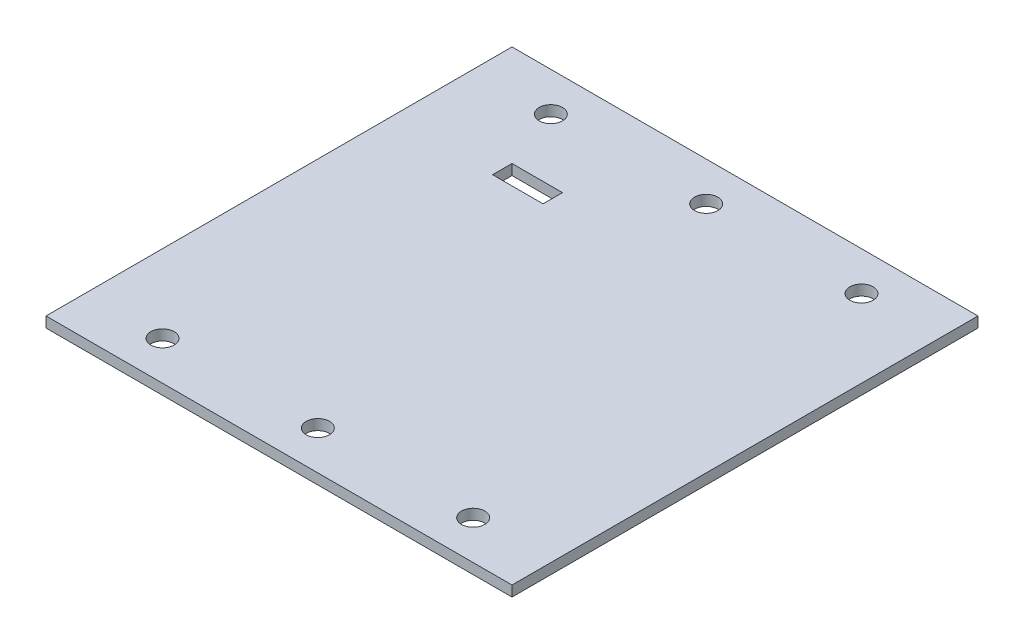
ISO-10303-21;
HEADER;
FILE_DESCRIPTION(('STEP AP214'),'2;1');
FILE_NAME('part.step','',(''),(''),'','','');
FILE_SCHEMA(('AUTOMOTIVE_DESIGN { 1 0 10303 214 1 1 1 1 }'));
ENDSEC;
DATA;
#1=APPLICATION_CONTEXT('core data for automotive mechanical design processes');
#2=APPLICATION_PROTOCOL_DEFINITION('international standard','automotive_design',2000,#1);
#3=PRODUCT_CONTEXT('',#1,'mechanical');
#4=PRODUCT('Part','Part','',(#3));
#5=PRODUCT_RELATED_PRODUCT_CATEGORY('part','',(#4));
#6=PRODUCT_DEFINITION_FORMATION('','',#4);
#7=PRODUCT_DEFINITION_CONTEXT('part definition',#1,'design');
#8=PRODUCT_DEFINITION('design','',#6,#7);
#9=PRODUCT_DEFINITION_SHAPE('','',#8);
#10=(LENGTH_UNIT() NAMED_UNIT(*) SI_UNIT(.MILLI.,.METRE.));
#11=(NAMED_UNIT(*) PLANE_ANGLE_UNIT() SI_UNIT($,.RADIAN.));
#12=(NAMED_UNIT(*) SI_UNIT($,.STERADIAN.) SOLID_ANGLE_UNIT());
#13=UNCERTAINTY_MEASURE_WITH_UNIT(LENGTH_MEASURE(1.E-05),#10,'distance_accuracy_value','');
#14=(GEOMETRIC_REPRESENTATION_CONTEXT(3) GLOBAL_UNCERTAINTY_ASSIGNED_CONTEXT((#13)) GLOBAL_UNIT_ASSIGNED_CONTEXT((#10,
#11,#12)) REPRESENTATION_CONTEXT('',''));
#15=CARTESIAN_POINT('',(0.,0.,0.));
#16=DIRECTION('',(0.,0.,1.));
#17=DIRECTION('',(1.,0.,0.));
#18=AXIS2_PLACEMENT_3D('',#15,#16,#17);
#19=CARTESIAN_POINT('',(60.,2.7,60.));
#20=DIRECTION('',(-1.,0.,0.));
#21=DIRECTION('',(0.,0.,1.));
#22=AXIS2_PLACEMENT_3D('',#19,#20,#21);
#23=PLANE('',#22);
#24=DIRECTION('',(0.,0.,-1.));
#25=VECTOR('',#24,1.);
#26=CARTESIAN_POINT('',(60.,0.,60.));
#27=LINE('',#26,#25);
#28=CARTESIAN_POINT('',(60.,0.,60.));
#29=VERTEX_POINT('',#28);
#30=CARTESIAN_POINT('',(60.,0.,-60.));
#31=VERTEX_POINT('',#30);
#32=EDGE_CURVE('E179',#29,#31,#27,.T.);
#33=ORIENTED_EDGE('',*,*,#32,.T.);
#34=DIRECTION('',(0.,-1.,0.));
#35=VECTOR('',#34,1.);
#36=CARTESIAN_POINT('',(60.,2.7,-60.));
#37=LINE('',#36,#35);
#38=CARTESIAN_POINT('',(60.,2.7,-60.));
#39=VERTEX_POINT('',#38);
#40=EDGE_CURVE('E13',#39,#31,#37,.T.);
#41=ORIENTED_EDGE('',*,*,#40,.F.);
#42=DIRECTION('',(0.,0.,-1.));
#43=VECTOR('',#42,1.);
#44=CARTESIAN_POINT('',(60.,2.7,60.));
#45=LINE('',#44,#43);
#46=CARTESIAN_POINT('',(60.,2.7,60.));
#47=VERTEX_POINT('',#46);
#48=EDGE_CURVE('E182',#47,#39,#45,.T.);
#49=ORIENTED_EDGE('',*,*,#48,.F.);
#50=DIRECTION('',(0.,-1.,0.));
#51=VECTOR('',#50,1.);
#52=CARTESIAN_POINT('',(60.,2.7,60.));
#53=LINE('',#52,#51);
#54=EDGE_CURVE('E192',#47,#29,#53,.T.);
#55=ORIENTED_EDGE('',*,*,#54,.T.);
#56=EDGE_LOOP('',(#33,#41,#49,#55));
#57=FACE_BOUND('',#56,.T.);
#58=ADVANCED_FACE('F45',(#57),#23,.F.);
#59=CARTESIAN_POINT('',(-60.,2.7,-60.));
#60=DIRECTION('',(0.,0.,1.));
#61=DIRECTION('',(1.,0.,0.));
#62=AXIS2_PLACEMENT_3D('',#59,#60,#61);
#63=PLANE('',#62);
#64=DIRECTION('',(-1.,0.,0.));
#65=VECTOR('',#64,1.);
#66=CARTESIAN_POINT('',(-60.,0.,-60.));
#67=LINE('',#66,#65);
#68=CARTESIAN_POINT('',(-60.,0.,-60.));
#69=VERTEX_POINT('',#68);
#70=EDGE_CURVE('E195',#31,#69,#67,.T.);
#71=ORIENTED_EDGE('',*,*,#70,.T.);
#72=DIRECTION('',(0.,-1.,0.));
#73=VECTOR('',#72,1.);
#74=CARTESIAN_POINT('',(-60.,2.7,-60.));
#75=LINE('',#74,#73);
#76=CARTESIAN_POINT('',(-60.,2.7,-60.));
#77=VERTEX_POINT('',#76);
#78=EDGE_CURVE('E52',#77,#69,#75,.T.);
#79=ORIENTED_EDGE('',*,*,#78,.F.);
#80=DIRECTION('',(-1.,0.,0.));
#81=VECTOR('',#80,1.);
#82=CARTESIAN_POINT('',(-60.,2.7,-60.));
#83=LINE('',#82,#81);
#84=EDGE_CURVE('E185',#39,#77,#83,.T.);
#85=ORIENTED_EDGE('',*,*,#84,.F.);
#86=ORIENTED_EDGE('',*,*,#40,.T.);
#87=EDGE_LOOP('',(#71,#79,#85,#86));
#88=FACE_BOUND('',#87,.T.);
#89=ADVANCED_FACE('F224',(#88),#63,.F.);
#90=CARTESIAN_POINT('',(-60.,2.7,60.));
#91=DIRECTION('',(1.,0.,0.));
#92=DIRECTION('',(0.,0.,-1.));
#93=AXIS2_PLACEMENT_3D('',#90,#91,#92);
#94=PLANE('',#93);
#95=DIRECTION('',(0.,0.,1.));
#96=VECTOR('',#95,1.);
#97=CARTESIAN_POINT('',(-60.,0.,60.));
#98=LINE('',#97,#96);
#99=CARTESIAN_POINT('',(-60.,0.,60.));
#100=VERTEX_POINT('',#99);
#101=EDGE_CURVE('E197',#69,#100,#98,.T.);
#102=ORIENTED_EDGE('',*,*,#101,.T.);
#103=DIRECTION('',(0.,-1.,0.));
#104=VECTOR('',#103,1.);
#105=CARTESIAN_POINT('',(-60.,2.7,60.));
#106=LINE('',#105,#104);
#107=CARTESIAN_POINT('',(-60.,2.7,60.));
#108=VERTEX_POINT('',#107);
#109=EDGE_CURVE('E202',#108,#100,#106,.T.);
#110=ORIENTED_EDGE('',*,*,#109,.F.);
#111=DIRECTION('',(0.,0.,1.));
#112=VECTOR('',#111,1.);
#113=CARTESIAN_POINT('',(-60.,2.7,60.));
#114=LINE('',#113,#112);
#115=EDGE_CURVE('E188',#77,#108,#114,.T.);
#116=ORIENTED_EDGE('',*,*,#115,.F.);
#117=ORIENTED_EDGE('',*,*,#78,.T.);
#118=EDGE_LOOP('',(#102,#110,#116,#117));
#119=FACE_BOUND('',#118,.T.);
#120=ADVANCED_FACE('F209',(#119),#94,.F.);
#121=CARTESIAN_POINT('',(-60.,2.7,60.));
#122=DIRECTION('',(0.,0.,-1.));
#123=DIRECTION('',(-1.,0.,0.));
#124=AXIS2_PLACEMENT_3D('',#121,#122,#123);
#125=PLANE('',#124);
#126=DIRECTION('',(1.,0.,0.));
#127=VECTOR('',#126,1.);
#128=CARTESIAN_POINT('',(-60.,0.,60.));
#129=LINE('',#128,#127);
#130=EDGE_CURVE('E186',#100,#29,#129,.T.);
#131=ORIENTED_EDGE('',*,*,#130,.T.);
#132=ORIENTED_EDGE('',*,*,#54,.F.);
#133=DIRECTION('',(1.,0.,0.));
#134=VECTOR('',#133,1.);
#135=CARTESIAN_POINT('',(-60.,2.7,60.));
#136=LINE('',#135,#134);
#137=EDGE_CURVE('E190',#108,#47,#136,.T.);
#138=ORIENTED_EDGE('',*,*,#137,.F.);
#139=ORIENTED_EDGE('',*,*,#109,.T.);
#140=EDGE_LOOP('',(#131,#132,#138,#139));
#141=FACE_BOUND('',#140,.T.);
#142=ADVANCED_FACE('F218',(#141),#125,.F.);
#143=CARTESIAN_POINT('',(0.,2.7,0.));
#144=DIRECTION('',(0.,-1.,0.));
#145=DIRECTION('',(0.,0.,-1.));
#146=AXIS2_PLACEMENT_3D('',#143,#144,#145);
#147=PLANE('',#146);
#148=DIRECTION('',(-1.,0.,0.));
#149=VECTOR('',#148,1.);
#150=CARTESIAN_POINT('',(-34.,2.7,-29.));
#151=LINE('',#150,#149);
#152=CARTESIAN_POINT('',(-21.,2.7,-29.));
#153=VERTEX_POINT('',#152);
#154=CARTESIAN_POINT('',(-34.,2.7,-29.));
#155=VERTEX_POINT('',#154);
#156=EDGE_CURVE('E117',#153,#155,#151,.T.);
#157=ORIENTED_EDGE('',*,*,#156,.T.);
#158=DIRECTION('',(0.,0.,-1.));
#159=VECTOR('',#158,1.);
#160=CARTESIAN_POINT('',(-34.,2.7,-34.));
#161=LINE('',#160,#159);
#162=CARTESIAN_POINT('',(-34.,2.7,-34.));
#163=VERTEX_POINT('',#162);
#164=EDGE_CURVE('E111',#155,#163,#161,.T.);
#165=ORIENTED_EDGE('',*,*,#164,.T.);
#166=DIRECTION('',(1.,0.,0.));
#167=VECTOR('',#166,1.);
#168=CARTESIAN_POINT('',(-34.,2.7,-34.));
#169=LINE('',#168,#167);
#170=CARTESIAN_POINT('',(-21.,2.7,-34.));
#171=VERTEX_POINT('',#170);
#172=EDGE_CURVE('E120',#163,#171,#169,.T.);
#173=ORIENTED_EDGE('',*,*,#172,.T.);
#174=DIRECTION('',(0.,0.,1.));
#175=VECTOR('',#174,1.);
#176=CARTESIAN_POINT('',(-21.,2.7,-34.));
#177=LINE('',#176,#175);
#178=EDGE_CURVE('E59',#171,#153,#177,.T.);
#179=ORIENTED_EDGE('',*,*,#178,.T.);
#180=EDGE_LOOP('',(#157,#165,#173,#179));
#181=FACE_BOUND('',#180,.T.);
#182=CARTESIAN_POINT('',(40.,2.7,-50.));
#183=DIRECTION('',(0.,1.,0.));
#184=DIRECTION('',(0.,0.,1.));
#185=AXIS2_PLACEMENT_3D('',#182,#183,#184);
#186=CIRCLE('',#185,3.);
#187=CARTESIAN_POINT('',(40.,2.7,-47.));
#188=VERTEX_POINT('',#187);
#189=EDGE_CURVE('E156',#188,#188,#186,.T.);
#190=ORIENTED_EDGE('',*,*,#189,.F.);
#191=EDGE_LOOP('',(#190));
#192=FACE_BOUND('',#191,.T.);
#193=CARTESIAN_POINT('',(-40.,2.7,-49.9999999999997));
#194=DIRECTION('',(0.,1.,0.));
#195=DIRECTION('',(0.,0.,1.));
#196=AXIS2_PLACEMENT_3D('',#193,#194,#195);
#197=CIRCLE('',#196,3.);
#198=CARTESIAN_POINT('',(-40.,2.7,-46.9999999999997));
#199=VERTEX_POINT('',#198);
#200=EDGE_CURVE('E162',#199,#199,#197,.T.);
#201=ORIENTED_EDGE('',*,*,#200,.F.);
#202=EDGE_LOOP('',(#201));
#203=FACE_BOUND('',#202,.T.);
#204=CARTESIAN_POINT('',(-40.,2.7,49.9999999999997));
#205=DIRECTION('',(0.,1.,0.));
#206=DIRECTION('',(0.,0.,-1.));
#207=AXIS2_PLACEMENT_3D('',#204,#205,#206);
#208=CIRCLE('',#207,3.);
#209=CARTESIAN_POINT('',(-40.,2.7,52.9999999999997));
#210=VERTEX_POINT('',#209);
#211=EDGE_CURVE('E168',#210,#210,#208,.T.);
#212=ORIENTED_EDGE('',*,*,#211,.F.);
#213=EDGE_LOOP('',(#212));
#214=FACE_BOUND('',#213,.T.);
#215=CARTESIAN_POINT('',(40.,2.7,50.));
#216=DIRECTION('',(0.,1.,0.));
#217=DIRECTION('',(0.,0.,-1.));
#218=AXIS2_PLACEMENT_3D('',#215,#216,#217);
#219=CIRCLE('',#218,3.);
#220=CARTESIAN_POINT('',(40.,2.7,53.));
#221=VERTEX_POINT('',#220);
#222=EDGE_CURVE('E149',#221,#221,#219,.T.);
#223=ORIENTED_EDGE('',*,*,#222,.F.);
#224=EDGE_LOOP('',(#223));
#225=FACE_BOUND('',#224,.T.);
#226=CARTESIAN_POINT('',(0.,2.7,50.));
#227=DIRECTION('',(0.,1.,0.));
#228=DIRECTION('',(0.,0.,-1.));
#229=AXIS2_PLACEMENT_3D('',#226,#227,#228);
#230=CIRCLE('',#229,3.00000000000001);
#231=CARTESIAN_POINT('',(0.,2.7,53.));
#232=VERTEX_POINT('',#231);
#233=EDGE_CURVE('E142',#232,#232,#230,.T.);
#234=ORIENTED_EDGE('',*,*,#233,.F.);
#235=EDGE_LOOP('',(#234));
#236=FACE_BOUND('',#235,.T.);
#237=CARTESIAN_POINT('',(0.,2.7,-50.));
#238=DIRECTION('',(0.,1.,0.));
#239=DIRECTION('',(0.,0.,1.));
#240=AXIS2_PLACEMENT_3D('',#237,#238,#239);
#241=CIRCLE('',#240,3.);
#242=CARTESIAN_POINT('',(0.,2.7,-47.));
#243=VERTEX_POINT('',#242);
#244=EDGE_CURVE('E155',#243,#243,#241,.T.);
#245=ORIENTED_EDGE('',*,*,#244,.F.);
#246=EDGE_LOOP('',(#245));
#247=FACE_BOUND('',#246,.T.);
#248=ORIENTED_EDGE('',*,*,#48,.T.);
#249=ORIENTED_EDGE('',*,*,#84,.T.);
#250=ORIENTED_EDGE('',*,*,#115,.T.);
#251=ORIENTED_EDGE('',*,*,#137,.T.);
#252=EDGE_LOOP('',(#248,#249,#250,#251));
#253=FACE_BOUND('',#252,.T.);
#254=ADVANCED_FACE('F124',(#181,#192,#203,#214,#225,#236,#247,#253),#147,.F.);
#255=CARTESIAN_POINT('',(0.,0.,0.));
#256=DIRECTION('',(0.,-1.,0.));
#257=DIRECTION('',(0.,0.,-1.));
#258=AXIS2_PLACEMENT_3D('',#255,#256,#257);
#259=PLANE('',#258);
#260=DIRECTION('',(0.,0.,-1.));
#261=VECTOR('',#260,1.);
#262=CARTESIAN_POINT('',(-34.,0.,-34.));
#263=LINE('',#262,#261);
#264=CARTESIAN_POINT('',(-34.,0.,-29.));
#265=VERTEX_POINT('',#264);
#266=CARTESIAN_POINT('',(-34.,0.,-34.));
#267=VERTEX_POINT('',#266);
#268=EDGE_CURVE('E67',#265,#267,#263,.T.);
#269=ORIENTED_EDGE('',*,*,#268,.F.);
#270=DIRECTION('',(-1.,0.,0.));
#271=VECTOR('',#270,1.);
#272=CARTESIAN_POINT('',(-34.,0.,-29.));
#273=LINE('',#272,#271);
#274=CARTESIAN_POINT('',(-21.,0.,-29.));
#275=VERTEX_POINT('',#274);
#276=EDGE_CURVE('E127',#275,#265,#273,.T.);
#277=ORIENTED_EDGE('',*,*,#276,.F.);
#278=DIRECTION('',(0.,0.,1.));
#279=VECTOR('',#278,1.);
#280=CARTESIAN_POINT('',(-21.,0.,-34.));
#281=LINE('',#280,#279);
#282=CARTESIAN_POINT('',(-21.,0.,-34.));
#283=VERTEX_POINT('',#282);
#284=EDGE_CURVE('E130',#283,#275,#281,.T.);
#285=ORIENTED_EDGE('',*,*,#284,.F.);
#286=DIRECTION('',(1.,0.,0.));
#287=VECTOR('',#286,1.);
#288=CARTESIAN_POINT('',(-34.,0.,-34.));
#289=LINE('',#288,#287);
#290=EDGE_CURVE('E136',#267,#283,#289,.T.);
#291=ORIENTED_EDGE('',*,*,#290,.F.);
#292=EDGE_LOOP('',(#269,#277,#285,#291));
#293=FACE_BOUND('',#292,.T.);
#294=CARTESIAN_POINT('',(40.,0.,-50.));
#295=DIRECTION('',(0.,1.,0.));
#296=DIRECTION('',(0.,0.,1.));
#297=AXIS2_PLACEMENT_3D('',#294,#295,#296);
#298=CIRCLE('',#297,3.);
#299=CARTESIAN_POINT('',(40.,0.,-47.));
#300=VERTEX_POINT('',#299);
#301=EDGE_CURVE('E152',#300,#300,#298,.T.);
#302=ORIENTED_EDGE('',*,*,#301,.T.);
#303=EDGE_LOOP('',(#302));
#304=FACE_BOUND('',#303,.T.);
#305=CARTESIAN_POINT('',(-40.,0.,-49.9999999999997));
#306=DIRECTION('',(0.,1.,0.));
#307=DIRECTION('',(0.,0.,1.));
#308=AXIS2_PLACEMENT_3D('',#305,#306,#307);
#309=CIRCLE('',#308,3.);
#310=CARTESIAN_POINT('',(-40.,0.,-46.9999999999997));
#311=VERTEX_POINT('',#310);
#312=EDGE_CURVE('E159',#311,#311,#309,.T.);
#313=ORIENTED_EDGE('',*,*,#312,.T.);
#314=EDGE_LOOP('',(#313));
#315=FACE_BOUND('',#314,.T.);
#316=CARTESIAN_POINT('',(-40.,0.,49.9999999999997));
#317=DIRECTION('',(0.,1.,0.));
#318=DIRECTION('',(0.,0.,-1.));
#319=AXIS2_PLACEMENT_3D('',#316,#317,#318);
#320=CIRCLE('',#319,3.);
#321=CARTESIAN_POINT('',(-40.,0.,52.9999999999997));
#322=VERTEX_POINT('',#321);
#323=EDGE_CURVE('E165',#322,#322,#320,.T.);
#324=ORIENTED_EDGE('',*,*,#323,.T.);
#325=EDGE_LOOP('',(#324));
#326=FACE_BOUND('',#325,.T.);
#327=CARTESIAN_POINT('',(40.,0.,50.));
#328=DIRECTION('',(0.,1.,0.));
#329=DIRECTION('',(0.,0.,-1.));
#330=AXIS2_PLACEMENT_3D('',#327,#328,#329);
#331=CIRCLE('',#330,3.);
#332=CARTESIAN_POINT('',(40.,0.,53.));
#333=VERTEX_POINT('',#332);
#334=EDGE_CURVE('E171',#333,#333,#331,.T.);
#335=ORIENTED_EDGE('',*,*,#334,.T.);
#336=EDGE_LOOP('',(#335));
#337=FACE_BOUND('',#336,.T.);
#338=CARTESIAN_POINT('',(0.,0.,50.));
#339=DIRECTION('',(0.,1.,0.));
#340=DIRECTION('',(0.,0.,-1.));
#341=AXIS2_PLACEMENT_3D('',#338,#339,#340);
#342=CIRCLE('',#341,3.00000000000001);
#343=CARTESIAN_POINT('',(0.,0.,53.));
#344=VERTEX_POINT('',#343);
#345=EDGE_CURVE('E146',#344,#344,#342,.T.);
#346=ORIENTED_EDGE('',*,*,#345,.T.);
#347=EDGE_LOOP('',(#346));
#348=FACE_BOUND('',#347,.T.);
#349=CARTESIAN_POINT('',(0.,0.,-50.));
#350=DIRECTION('',(0.,1.,0.));
#351=DIRECTION('',(0.,0.,1.));
#352=AXIS2_PLACEMENT_3D('',#349,#350,#351);
#353=CIRCLE('',#352,3.);
#354=CARTESIAN_POINT('',(0.,0.,-47.));
#355=VERTEX_POINT('',#354);
#356=EDGE_CURVE('E176',#355,#355,#353,.T.);
#357=ORIENTED_EDGE('',*,*,#356,.T.);
#358=EDGE_LOOP('',(#357));
#359=FACE_BOUND('',#358,.T.);
#360=ORIENTED_EDGE('',*,*,#32,.F.);
#361=ORIENTED_EDGE('',*,*,#130,.F.);
#362=ORIENTED_EDGE('',*,*,#101,.F.);
#363=ORIENTED_EDGE('',*,*,#70,.F.);
#364=EDGE_LOOP('',(#360,#361,#362,#363));
#365=FACE_BOUND('',#364,.T.);
#366=ADVANCED_FACE('F215',(#293,#304,#315,#326,#337,#348,#359,#365),#259,.T.);
#367=CARTESIAN_POINT('',(0.,0.,-50.));
#368=DIRECTION('',(0.,1.,0.));
#369=DIRECTION('',(0.,0.,1.));
#370=AXIS2_PLACEMENT_3D('',#367,#368,#369);
#371=CYLINDRICAL_SURFACE('',#370,3.);
#372=CARTESIAN_POINT('',(0.,0.,-47.));
#373=CARTESIAN_POINT('',(0.,0.028125,-47.));
#374=CARTESIAN_POINT('',(0.,0.05625,-47.));
#375=CARTESIAN_POINT('',(0.,0.1125,-47.));
#376=CARTESIAN_POINT('',(0.,0.140625,-47.));
#377=CARTESIAN_POINT('',(0.,0.196875,-47.));
#378=CARTESIAN_POINT('',(0.,0.225,-47.));
#379=CARTESIAN_POINT('',(0.,0.28125,-47.));
#380=CARTESIAN_POINT('',(0.,0.309375,-47.));
#381=CARTESIAN_POINT('',(0.,0.365625,-47.));
#382=CARTESIAN_POINT('',(0.,0.39375,-47.));
#383=CARTESIAN_POINT('',(0.,0.45,-47.));
#384=CARTESIAN_POINT('',(0.,0.478125,-47.));
#385=CARTESIAN_POINT('',(0.,0.534375,-47.));
#386=CARTESIAN_POINT('',(0.,0.5625,-47.));
#387=CARTESIAN_POINT('',(0.,0.61875,-47.));
#388=CARTESIAN_POINT('',(0.,0.646875,-47.));
#389=CARTESIAN_POINT('',(0.,0.703125,-47.));
#390=CARTESIAN_POINT('',(0.,0.73125,-47.));
#391=CARTESIAN_POINT('',(0.,0.7875,-47.));
#392=CARTESIAN_POINT('',(0.,0.815625,-47.));
#393=CARTESIAN_POINT('',(0.,0.871875,-47.));
#394=CARTESIAN_POINT('',(0.,0.9,-47.));
#395=CARTESIAN_POINT('',(0.,0.95625,-47.));
#396=CARTESIAN_POINT('',(0.,0.984375,-47.));
#397=CARTESIAN_POINT('',(0.,1.040625,-47.));
#398=CARTESIAN_POINT('',(0.,1.06875,-47.));
#399=CARTESIAN_POINT('',(0.,1.125,-47.));
#400=CARTESIAN_POINT('',(0.,1.153125,-47.));
#401=CARTESIAN_POINT('',(0.,1.209375,-47.));
#402=CARTESIAN_POINT('',(0.,1.2375,-47.));
#403=CARTESIAN_POINT('',(0.,1.29375,-47.));
#404=CARTESIAN_POINT('',(0.,1.321875,-47.));
#405=CARTESIAN_POINT('',(0.,1.378125,-47.));
#406=CARTESIAN_POINT('',(0.,1.40625,-47.));
#407=CARTESIAN_POINT('',(0.,1.4625,-47.));
#408=CARTESIAN_POINT('',(0.,1.490625,-47.));
#409=CARTESIAN_POINT('',(0.,1.546875,-47.));
#410=CARTESIAN_POINT('',(0.,1.575,-47.));
#411=CARTESIAN_POINT('',(0.,1.63125,-47.));
#412=CARTESIAN_POINT('',(0.,1.659375,-47.));
#413=CARTESIAN_POINT('',(0.,1.715625,-47.));
#414=CARTESIAN_POINT('',(0.,1.74375,-47.));
#415=CARTESIAN_POINT('',(0.,1.8,-47.));
#416=CARTESIAN_POINT('',(0.,1.828125,-47.));
#417=CARTESIAN_POINT('',(0.,1.884375,-47.));
#418=CARTESIAN_POINT('',(0.,1.9125,-47.));
#419=CARTESIAN_POINT('',(0.,1.96875,-47.));
#420=CARTESIAN_POINT('',(0.,1.996875,-47.));
#421=CARTESIAN_POINT('',(0.,2.053125,-47.));
#422=CARTESIAN_POINT('',(0.,2.08125,-47.));
#423=CARTESIAN_POINT('',(0.,2.1375,-47.));
#424=CARTESIAN_POINT('',(0.,2.165625,-47.));
#425=CARTESIAN_POINT('',(0.,2.221875,-47.));
#426=CARTESIAN_POINT('',(0.,2.25,-47.));
#427=CARTESIAN_POINT('',(0.,2.30625,-47.));
#428=CARTESIAN_POINT('',(0.,2.334375,-47.));
#429=CARTESIAN_POINT('',(0.,2.390625,-47.));
#430=CARTESIAN_POINT('',(0.,2.41875,-47.));
#431=CARTESIAN_POINT('',(0.,2.475,-47.));
#432=CARTESIAN_POINT('',(0.,2.503125,-47.));
#433=CARTESIAN_POINT('',(0.,2.559375,-47.));
#434=CARTESIAN_POINT('',(0.,2.5875,-47.));
#435=CARTESIAN_POINT('',(0.,2.64375,-47.));
#436=CARTESIAN_POINT('',(0.,2.671875,-47.));
#437=CARTESIAN_POINT('',(0.,2.7,-47.));
#438=B_SPLINE_CURVE_WITH_KNOTS('',3,(#372,#373,#374,#375,#376,#377,#378,#379,#380,#381,#382,
#383,#384,#385,#386,#387,#388,#389,#390,#391,#392,#393,#394,#395,#396,#397,#398,#399,#400,#401,
#402,#403,#404,#405,#406,#407,#408,#409,#410,#411,#412,#413,#414,#415,#416,#417,#418,#419,#420,
#421,#422,#423,#424,#425,#426,#427,#428,#429,#430,#431,#432,#433,#434,#435,#436,#437),
.UNSPECIFIED.,.F.,.F.,(4,2,2,2,2,2,2,2,2,2,2,2,2,2,2,2,2,2,2,2,2,2,2,2,2,2,2,2,2,2,2,2,4),(0.,
0.084375,0.16875,0.253125,0.3375,0.421875,0.50625,0.590625,0.675,0.759375,0.84375,0.928125,
1.0125,1.096875,1.18125,1.265625,1.35,1.434375,1.51875,1.603125,1.6875,1.771875,1.85625,
1.940625,2.025,2.109375,2.19375,2.278125,2.3625,2.446875,2.53125,2.615625,2.7),.UNSPECIFIED.);
#439=EDGE_CURVE('BSEAM236',#355,#243,#438,.T.);
#440=ORIENTED_EDGE('',*,*,#356,.F.);
#441=ORIENTED_EDGE('',*,*,#244,.T.);
#442=ORIENTED_EDGE('',*,*,#439,.T.);
#443=ORIENTED_EDGE('',*,*,#439,.F.);
#444=EDGE_LOOP('',(#440,#442,#441,#443));
#445=FACE_BOUND('',#444,.T.);
#446=ADVANCED_FACE('F236',(#445),#371,.F.);
#447=CARTESIAN_POINT('',(0.,0.,50.));
#448=DIRECTION('',(0.,1.,0.));
#449=DIRECTION('',(0.,0.,1.));
#450=AXIS2_PLACEMENT_3D('',#447,#448,#449);
#451=CYLINDRICAL_SURFACE('',#450,3.00000000000001);
#452=CARTESIAN_POINT('',(0.,0.,53.));
#453=CARTESIAN_POINT('',(0.,0.028125,53.));
#454=CARTESIAN_POINT('',(0.,0.05625,53.));
#455=CARTESIAN_POINT('',(0.,0.1125,53.));
#456=CARTESIAN_POINT('',(0.,0.140625,53.));
#457=CARTESIAN_POINT('',(0.,0.196875,53.));
#458=CARTESIAN_POINT('',(0.,0.225,53.));
#459=CARTESIAN_POINT('',(0.,0.28125,53.));
#460=CARTESIAN_POINT('',(0.,0.309375,53.));
#461=CARTESIAN_POINT('',(0.,0.365625,53.));
#462=CARTESIAN_POINT('',(0.,0.39375,53.));
#463=CARTESIAN_POINT('',(0.,0.45,53.));
#464=CARTESIAN_POINT('',(0.,0.478125,53.));
#465=CARTESIAN_POINT('',(0.,0.534375,53.));
#466=CARTESIAN_POINT('',(0.,0.5625,53.));
#467=CARTESIAN_POINT('',(0.,0.61875,53.));
#468=CARTESIAN_POINT('',(0.,0.646875,53.));
#469=CARTESIAN_POINT('',(0.,0.703125,53.));
#470=CARTESIAN_POINT('',(0.,0.73125,53.));
#471=CARTESIAN_POINT('',(0.,0.7875,53.));
#472=CARTESIAN_POINT('',(0.,0.815625,53.));
#473=CARTESIAN_POINT('',(0.,0.871875,53.));
#474=CARTESIAN_POINT('',(0.,0.9,53.));
#475=CARTESIAN_POINT('',(0.,0.95625,53.));
#476=CARTESIAN_POINT('',(0.,0.984375,53.));
#477=CARTESIAN_POINT('',(0.,1.040625,53.));
#478=CARTESIAN_POINT('',(0.,1.06875,53.));
#479=CARTESIAN_POINT('',(0.,1.125,53.));
#480=CARTESIAN_POINT('',(0.,1.153125,53.));
#481=CARTESIAN_POINT('',(0.,1.209375,53.));
#482=CARTESIAN_POINT('',(0.,1.2375,53.));
#483=CARTESIAN_POINT('',(0.,1.29375,53.));
#484=CARTESIAN_POINT('',(0.,1.321875,53.));
#485=CARTESIAN_POINT('',(0.,1.378125,53.));
#486=CARTESIAN_POINT('',(0.,1.40625,53.));
#487=CARTESIAN_POINT('',(0.,1.4625,53.));
#488=CARTESIAN_POINT('',(0.,1.490625,53.));
#489=CARTESIAN_POINT('',(0.,1.546875,53.));
#490=CARTESIAN_POINT('',(0.,1.575,53.));
#491=CARTESIAN_POINT('',(0.,1.63125,53.));
#492=CARTESIAN_POINT('',(0.,1.659375,53.));
#493=CARTESIAN_POINT('',(0.,1.715625,53.));
#494=CARTESIAN_POINT('',(0.,1.74375,53.));
#495=CARTESIAN_POINT('',(0.,1.8,53.));
#496=CARTESIAN_POINT('',(0.,1.828125,53.));
#497=CARTESIAN_POINT('',(0.,1.884375,53.));
#498=CARTESIAN_POINT('',(0.,1.9125,53.));
#499=CARTESIAN_POINT('',(0.,1.96875,53.));
#500=CARTESIAN_POINT('',(0.,1.996875,53.));
#501=CARTESIAN_POINT('',(0.,2.053125,53.));
#502=CARTESIAN_POINT('',(0.,2.08125,53.));
#503=CARTESIAN_POINT('',(0.,2.1375,53.));
#504=CARTESIAN_POINT('',(0.,2.165625,53.));
#505=CARTESIAN_POINT('',(0.,2.221875,53.));
#506=CARTESIAN_POINT('',(0.,2.25,53.));
#507=CARTESIAN_POINT('',(0.,2.30625,53.));
#508=CARTESIAN_POINT('',(0.,2.334375,53.));
#509=CARTESIAN_POINT('',(0.,2.390625,53.));
#510=CARTESIAN_POINT('',(0.,2.41875,53.));
#511=CARTESIAN_POINT('',(0.,2.475,53.));
#512=CARTESIAN_POINT('',(0.,2.503125,53.));
#513=CARTESIAN_POINT('',(0.,2.559375,53.));
#514=CARTESIAN_POINT('',(0.,2.5875,53.));
#515=CARTESIAN_POINT('',(0.,2.64375,53.));
#516=CARTESIAN_POINT('',(0.,2.671875,53.));
#517=CARTESIAN_POINT('',(0.,2.7,53.));
#518=B_SPLINE_CURVE_WITH_KNOTS('',3,(#452,#453,#454,#455,#456,#457,#458,#459,#460,#461,#462,
#463,#464,#465,#466,#467,#468,#469,#470,#471,#472,#473,#474,#475,#476,#477,#478,#479,#480,#481,
#482,#483,#484,#485,#486,#487,#488,#489,#490,#491,#492,#493,#494,#495,#496,#497,#498,#499,#500,
#501,#502,#503,#504,#505,#506,#507,#508,#509,#510,#511,#512,#513,#514,#515,#516,#517),
.UNSPECIFIED.,.F.,.F.,(4,2,2,2,2,2,2,2,2,2,2,2,2,2,2,2,2,2,2,2,2,2,2,2,2,2,2,2,2,2,2,2,4),(0.,
0.084375,0.16875,0.253125,0.3375,0.421875,0.50625,0.590625,0.675,0.759375,0.84375,0.928125,
1.0125,1.096875,1.18125,1.265625,1.35,1.434375,1.51875,1.603125,1.6875,1.771875,1.85625,
1.940625,2.025,2.109375,2.19375,2.278125,2.3625,2.446875,2.53125,2.615625,2.7),.UNSPECIFIED.);
#519=EDGE_CURVE('BSEAM242',#344,#232,#518,.T.);
#520=ORIENTED_EDGE('',*,*,#345,.F.);
#521=ORIENTED_EDGE('',*,*,#233,.T.);
#522=ORIENTED_EDGE('',*,*,#519,.T.);
#523=ORIENTED_EDGE('',*,*,#519,.F.);
#524=EDGE_LOOP('',(#520,#522,#521,#523));
#525=FACE_BOUND('',#524,.T.);
#526=ADVANCED_FACE('F242',(#525),#451,.F.);
#527=CARTESIAN_POINT('',(40.,0.,50.));
#528=DIRECTION('',(0.,1.,0.));
#529=DIRECTION('',(0.,0.,1.));
#530=AXIS2_PLACEMENT_3D('',#527,#528,#529);
#531=CYLINDRICAL_SURFACE('',#530,3.);
#532=CARTESIAN_POINT('',(40.,0.,53.));
#533=CARTESIAN_POINT('',(40.,0.028125,53.));
#534=CARTESIAN_POINT('',(40.,0.05625,53.));
#535=CARTESIAN_POINT('',(40.,0.1125,53.));
#536=CARTESIAN_POINT('',(40.,0.140625,53.));
#537=CARTESIAN_POINT('',(40.,0.196875,53.));
#538=CARTESIAN_POINT('',(40.,0.225,53.));
#539=CARTESIAN_POINT('',(40.,0.28125,53.));
#540=CARTESIAN_POINT('',(40.,0.309375,53.));
#541=CARTESIAN_POINT('',(40.,0.365625,53.));
#542=CARTESIAN_POINT('',(40.,0.39375,53.));
#543=CARTESIAN_POINT('',(40.,0.45,53.));
#544=CARTESIAN_POINT('',(40.,0.478125,53.));
#545=CARTESIAN_POINT('',(40.,0.534375,53.));
#546=CARTESIAN_POINT('',(40.,0.5625,53.));
#547=CARTESIAN_POINT('',(40.,0.61875,53.));
#548=CARTESIAN_POINT('',(40.,0.646875,53.));
#549=CARTESIAN_POINT('',(40.,0.703125,53.));
#550=CARTESIAN_POINT('',(40.,0.73125,53.));
#551=CARTESIAN_POINT('',(40.,0.7875,53.));
#552=CARTESIAN_POINT('',(40.,0.815625,53.));
#553=CARTESIAN_POINT('',(40.,0.871875,53.));
#554=CARTESIAN_POINT('',(40.,0.9,53.));
#555=CARTESIAN_POINT('',(40.,0.95625,53.));
#556=CARTESIAN_POINT('',(40.,0.984375,53.));
#557=CARTESIAN_POINT('',(40.,1.040625,53.));
#558=CARTESIAN_POINT('',(40.,1.06875,53.));
#559=CARTESIAN_POINT('',(40.,1.125,53.));
#560=CARTESIAN_POINT('',(40.,1.153125,53.));
#561=CARTESIAN_POINT('',(40.,1.209375,53.));
#562=CARTESIAN_POINT('',(40.,1.2375,53.));
#563=CARTESIAN_POINT('',(40.,1.29375,53.));
#564=CARTESIAN_POINT('',(40.,1.321875,53.));
#565=CARTESIAN_POINT('',(40.,1.378125,53.));
#566=CARTESIAN_POINT('',(40.,1.40625,53.));
#567=CARTESIAN_POINT('',(40.,1.4625,53.));
#568=CARTESIAN_POINT('',(40.,1.490625,53.));
#569=CARTESIAN_POINT('',(40.,1.546875,53.));
#570=CARTESIAN_POINT('',(40.,1.575,53.));
#571=CARTESIAN_POINT('',(40.,1.63125,53.));
#572=CARTESIAN_POINT('',(40.,1.659375,53.));
#573=CARTESIAN_POINT('',(40.,1.715625,53.));
#574=CARTESIAN_POINT('',(40.,1.74375,53.));
#575=CARTESIAN_POINT('',(40.,1.8,53.));
#576=CARTESIAN_POINT('',(40.,1.828125,53.));
#577=CARTESIAN_POINT('',(40.,1.884375,53.));
#578=CARTESIAN_POINT('',(40.,1.9125,53.));
#579=CARTESIAN_POINT('',(40.,1.96875,53.));
#580=CARTESIAN_POINT('',(40.,1.996875,53.));
#581=CARTESIAN_POINT('',(40.,2.053125,53.));
#582=CARTESIAN_POINT('',(40.,2.08125,53.));
#583=CARTESIAN_POINT('',(40.,2.1375,53.));
#584=CARTESIAN_POINT('',(40.,2.165625,53.));
#585=CARTESIAN_POINT('',(40.,2.221875,53.));
#586=CARTESIAN_POINT('',(40.,2.25,53.));
#587=CARTESIAN_POINT('',(40.,2.30625,53.));
#588=CARTESIAN_POINT('',(40.,2.334375,53.));
#589=CARTESIAN_POINT('',(40.,2.390625,53.));
#590=CARTESIAN_POINT('',(40.,2.41875,53.));
#591=CARTESIAN_POINT('',(40.,2.475,53.));
#592=CARTESIAN_POINT('',(40.,2.503125,53.));
#593=CARTESIAN_POINT('',(40.,2.559375,53.));
#594=CARTESIAN_POINT('',(40.,2.5875,53.));
#595=CARTESIAN_POINT('',(40.,2.64375,53.));
#596=CARTESIAN_POINT('',(40.,2.671875,53.));
#597=CARTESIAN_POINT('',(40.,2.7,53.));
#598=B_SPLINE_CURVE_WITH_KNOTS('',3,(#532,#533,#534,#535,#536,#537,#538,#539,#540,#541,#542,
#543,#544,#545,#546,#547,#548,#549,#550,#551,#552,#553,#554,#555,#556,#557,#558,#559,#560,#561,
#562,#563,#564,#565,#566,#567,#568,#569,#570,#571,#572,#573,#574,#575,#576,#577,#578,#579,#580,
#581,#582,#583,#584,#585,#586,#587,#588,#589,#590,#591,#592,#593,#594,#595,#596,#597),
.UNSPECIFIED.,.F.,.F.,(4,2,2,2,2,2,2,2,2,2,2,2,2,2,2,2,2,2,2,2,2,2,2,2,2,2,2,2,2,2,2,2,4),(0.,
0.084375,0.16875,0.253125,0.3375,0.421875,0.50625,0.590625,0.675,0.759375,0.84375,0.928125,
1.0125,1.096875,1.18125,1.265625,1.35,1.434375,1.51875,1.603125,1.6875,1.771875,1.85625,
1.940625,2.025,2.109375,2.19375,2.278125,2.3625,2.446875,2.53125,2.615625,2.7),.UNSPECIFIED.);
#599=EDGE_CURVE('BSEAM244',#333,#221,#598,.T.);
#600=ORIENTED_EDGE('',*,*,#334,.F.);
#601=ORIENTED_EDGE('',*,*,#222,.T.);
#602=ORIENTED_EDGE('',*,*,#599,.T.);
#603=ORIENTED_EDGE('',*,*,#599,.F.);
#604=EDGE_LOOP('',(#600,#602,#601,#603));
#605=FACE_BOUND('',#604,.T.);
#606=ADVANCED_FACE('F244',(#605),#531,.F.);
#607=CARTESIAN_POINT('',(-40.,0.,49.9999999999997));
#608=DIRECTION('',(0.,1.,0.));
#609=DIRECTION('',(0.,0.,1.));
#610=AXIS2_PLACEMENT_3D('',#607,#608,#609);
#611=CYLINDRICAL_SURFACE('',#610,3.);
#612=CARTESIAN_POINT('',(-40.,0.,52.9999999999997));
#613=CARTESIAN_POINT('',(-40.,0.028125,52.9999999999997));
#614=CARTESIAN_POINT('',(-40.,0.05625,52.9999999999997));
#615=CARTESIAN_POINT('',(-40.,0.1125,52.9999999999997));
#616=CARTESIAN_POINT('',(-40.,0.140625,52.9999999999997));
#617=CARTESIAN_POINT('',(-40.,0.196875,52.9999999999997));
#618=CARTESIAN_POINT('',(-40.,0.225,52.9999999999997));
#619=CARTESIAN_POINT('',(-40.,0.28125,52.9999999999997));
#620=CARTESIAN_POINT('',(-40.,0.309375,52.9999999999997));
#621=CARTESIAN_POINT('',(-40.,0.365625,52.9999999999997));
#622=CARTESIAN_POINT('',(-40.,0.39375,52.9999999999997));
#623=CARTESIAN_POINT('',(-40.,0.45,52.9999999999997));
#624=CARTESIAN_POINT('',(-40.,0.478125,52.9999999999997));
#625=CARTESIAN_POINT('',(-40.,0.534375,52.9999999999997));
#626=CARTESIAN_POINT('',(-40.,0.5625,52.9999999999997));
#627=CARTESIAN_POINT('',(-40.,0.61875,52.9999999999997));
#628=CARTESIAN_POINT('',(-40.,0.646875,52.9999999999997));
#629=CARTESIAN_POINT('',(-40.,0.703125,52.9999999999997));
#630=CARTESIAN_POINT('',(-40.,0.73125,52.9999999999997));
#631=CARTESIAN_POINT('',(-40.,0.7875,52.9999999999997));
#632=CARTESIAN_POINT('',(-40.,0.815625,52.9999999999997));
#633=CARTESIAN_POINT('',(-40.,0.871875,52.9999999999997));
#634=CARTESIAN_POINT('',(-40.,0.9,52.9999999999997));
#635=CARTESIAN_POINT('',(-40.,0.95625,52.9999999999997));
#636=CARTESIAN_POINT('',(-40.,0.984375,52.9999999999997));
#637=CARTESIAN_POINT('',(-40.,1.040625,52.9999999999997));
#638=CARTESIAN_POINT('',(-40.,1.06875,52.9999999999997));
#639=CARTESIAN_POINT('',(-40.,1.125,52.9999999999997));
#640=CARTESIAN_POINT('',(-40.,1.153125,52.9999999999997));
#641=CARTESIAN_POINT('',(-40.,1.209375,52.9999999999997));
#642=CARTESIAN_POINT('',(-40.,1.2375,52.9999999999997));
#643=CARTESIAN_POINT('',(-40.,1.29375,52.9999999999997));
#644=CARTESIAN_POINT('',(-40.,1.321875,52.9999999999997));
#645=CARTESIAN_POINT('',(-40.,1.378125,52.9999999999997));
#646=CARTESIAN_POINT('',(-40.,1.40625,52.9999999999997));
#647=CARTESIAN_POINT('',(-40.,1.4625,52.9999999999997));
#648=CARTESIAN_POINT('',(-40.,1.490625,52.9999999999997));
#649=CARTESIAN_POINT('',(-40.,1.546875,52.9999999999997));
#650=CARTESIAN_POINT('',(-40.,1.575,52.9999999999997));
#651=CARTESIAN_POINT('',(-40.,1.63125,52.9999999999997));
#652=CARTESIAN_POINT('',(-40.,1.659375,52.9999999999997));
#653=CARTESIAN_POINT('',(-40.,1.715625,52.9999999999997));
#654=CARTESIAN_POINT('',(-40.,1.74375,52.9999999999997));
#655=CARTESIAN_POINT('',(-40.,1.8,52.9999999999997));
#656=CARTESIAN_POINT('',(-40.,1.828125,52.9999999999997));
#657=CARTESIAN_POINT('',(-40.,1.884375,52.9999999999997));
#658=CARTESIAN_POINT('',(-40.,1.9125,52.9999999999997));
#659=CARTESIAN_POINT('',(-40.,1.96875,52.9999999999997));
#660=CARTESIAN_POINT('',(-40.,1.996875,52.9999999999997));
#661=CARTESIAN_POINT('',(-40.,2.053125,52.9999999999997));
#662=CARTESIAN_POINT('',(-40.,2.08125,52.9999999999997));
#663=CARTESIAN_POINT('',(-40.,2.1375,52.9999999999997));
#664=CARTESIAN_POINT('',(-40.,2.165625,52.9999999999997));
#665=CARTESIAN_POINT('',(-40.,2.221875,52.9999999999997));
#666=CARTESIAN_POINT('',(-40.,2.25,52.9999999999997));
#667=CARTESIAN_POINT('',(-40.,2.30625,52.9999999999997));
#668=CARTESIAN_POINT('',(-40.,2.334375,52.9999999999997));
#669=CARTESIAN_POINT('',(-40.,2.390625,52.9999999999997));
#670=CARTESIAN_POINT('',(-40.,2.41875,52.9999999999997));
#671=CARTESIAN_POINT('',(-40.,2.475,52.9999999999997));
#672=CARTESIAN_POINT('',(-40.,2.503125,52.9999999999997));
#673=CARTESIAN_POINT('',(-40.,2.559375,52.9999999999997));
#674=CARTESIAN_POINT('',(-40.,2.5875,52.9999999999997));
#675=CARTESIAN_POINT('',(-40.,2.64375,52.9999999999997));
#676=CARTESIAN_POINT('',(-40.,2.671875,52.9999999999997));
#677=CARTESIAN_POINT('',(-40.,2.7,52.9999999999997));
#678=B_SPLINE_CURVE_WITH_KNOTS('',3,(#612,#613,#614,#615,#616,#617,#618,#619,#620,#621,#622,
#623,#624,#625,#626,#627,#628,#629,#630,#631,#632,#633,#634,#635,#636,#637,#638,#639,#640,#641,
#642,#643,#644,#645,#646,#647,#648,#649,#650,#651,#652,#653,#654,#655,#656,#657,#658,#659,#660,
#661,#662,#663,#664,#665,#666,#667,#668,#669,#670,#671,#672,#673,#674,#675,#676,#677),
.UNSPECIFIED.,.F.,.F.,(4,2,2,2,2,2,2,2,2,2,2,2,2,2,2,2,2,2,2,2,2,2,2,2,2,2,2,2,2,2,2,2,4),(0.,
0.084375,0.16875,0.253125,0.3375,0.421875,0.50625,0.590625,0.675,0.759375,0.84375,0.928125,
1.0125,1.096875,1.18125,1.265625,1.35,1.434375,1.51875,1.603125,1.6875,1.771875,1.85625,
1.940625,2.025,2.109375,2.19375,2.278125,2.3625,2.446875,2.53125,2.615625,2.7),.UNSPECIFIED.);
#679=EDGE_CURVE('BSEAM247',#322,#210,#678,.T.);
#680=ORIENTED_EDGE('',*,*,#323,.F.);
#681=ORIENTED_EDGE('',*,*,#211,.T.);
#682=ORIENTED_EDGE('',*,*,#679,.T.);
#683=ORIENTED_EDGE('',*,*,#679,.F.);
#684=EDGE_LOOP('',(#680,#682,#681,#683));
#685=FACE_BOUND('',#684,.T.);
#686=ADVANCED_FACE('F247',(#685),#611,.F.);
#687=CARTESIAN_POINT('',(-40.,0.,-49.9999999999997));
#688=DIRECTION('',(0.,1.,0.));
#689=DIRECTION('',(0.,0.,1.));
#690=AXIS2_PLACEMENT_3D('',#687,#688,#689);
#691=CYLINDRICAL_SURFACE('',#690,3.);
#692=CARTESIAN_POINT('',(-40.,0.,-46.9999999999997));
#693=CARTESIAN_POINT('',(-40.,0.028125,-46.9999999999997));
#694=CARTESIAN_POINT('',(-40.,0.05625,-46.9999999999997));
#695=CARTESIAN_POINT('',(-40.,0.1125,-46.9999999999997));
#696=CARTESIAN_POINT('',(-40.,0.140625,-46.9999999999997));
#697=CARTESIAN_POINT('',(-40.,0.196875,-46.9999999999997));
#698=CARTESIAN_POINT('',(-40.,0.225,-46.9999999999997));
#699=CARTESIAN_POINT('',(-40.,0.28125,-46.9999999999997));
#700=CARTESIAN_POINT('',(-40.,0.309375,-46.9999999999997));
#701=CARTESIAN_POINT('',(-40.,0.365625,-46.9999999999997));
#702=CARTESIAN_POINT('',(-40.,0.39375,-46.9999999999997));
#703=CARTESIAN_POINT('',(-40.,0.45,-46.9999999999997));
#704=CARTESIAN_POINT('',(-40.,0.478125,-46.9999999999997));
#705=CARTESIAN_POINT('',(-40.,0.534375,-46.9999999999997));
#706=CARTESIAN_POINT('',(-40.,0.5625,-46.9999999999997));
#707=CARTESIAN_POINT('',(-40.,0.61875,-46.9999999999997));
#708=CARTESIAN_POINT('',(-40.,0.646875,-46.9999999999997));
#709=CARTESIAN_POINT('',(-40.,0.703125,-46.9999999999997));
#710=CARTESIAN_POINT('',(-40.,0.73125,-46.9999999999997));
#711=CARTESIAN_POINT('',(-40.,0.7875,-46.9999999999997));
#712=CARTESIAN_POINT('',(-40.,0.815625,-46.9999999999997));
#713=CARTESIAN_POINT('',(-40.,0.871875,-46.9999999999997));
#714=CARTESIAN_POINT('',(-40.,0.9,-46.9999999999997));
#715=CARTESIAN_POINT('',(-40.,0.95625,-46.9999999999997));
#716=CARTESIAN_POINT('',(-40.,0.984375,-46.9999999999997));
#717=CARTESIAN_POINT('',(-40.,1.040625,-46.9999999999997));
#718=CARTESIAN_POINT('',(-40.,1.06875,-46.9999999999997));
#719=CARTESIAN_POINT('',(-40.,1.125,-46.9999999999997));
#720=CARTESIAN_POINT('',(-40.,1.153125,-46.9999999999997));
#721=CARTESIAN_POINT('',(-40.,1.209375,-46.9999999999997));
#722=CARTESIAN_POINT('',(-40.,1.2375,-46.9999999999997));
#723=CARTESIAN_POINT('',(-40.,1.29375,-46.9999999999997));
#724=CARTESIAN_POINT('',(-40.,1.321875,-46.9999999999997));
#725=CARTESIAN_POINT('',(-40.,1.378125,-46.9999999999997));
#726=CARTESIAN_POINT('',(-40.,1.40625,-46.9999999999997));
#727=CARTESIAN_POINT('',(-40.,1.4625,-46.9999999999997));
#728=CARTESIAN_POINT('',(-40.,1.490625,-46.9999999999997));
#729=CARTESIAN_POINT('',(-40.,1.546875,-46.9999999999997));
#730=CARTESIAN_POINT('',(-40.,1.575,-46.9999999999997));
#731=CARTESIAN_POINT('',(-40.,1.63125,-46.9999999999997));
#732=CARTESIAN_POINT('',(-40.,1.659375,-46.9999999999997));
#733=CARTESIAN_POINT('',(-40.,1.715625,-46.9999999999997));
#734=CARTESIAN_POINT('',(-40.,1.74375,-46.9999999999997));
#735=CARTESIAN_POINT('',(-40.,1.8,-46.9999999999997));
#736=CARTESIAN_POINT('',(-40.,1.828125,-46.9999999999997));
#737=CARTESIAN_POINT('',(-40.,1.884375,-46.9999999999997));
#738=CARTESIAN_POINT('',(-40.,1.9125,-46.9999999999997));
#739=CARTESIAN_POINT('',(-40.,1.96875,-46.9999999999997));
#740=CARTESIAN_POINT('',(-40.,1.996875,-46.9999999999997));
#741=CARTESIAN_POINT('',(-40.,2.053125,-46.9999999999997));
#742=CARTESIAN_POINT('',(-40.,2.08125,-46.9999999999997));
#743=CARTESIAN_POINT('',(-40.,2.1375,-46.9999999999997));
#744=CARTESIAN_POINT('',(-40.,2.165625,-46.9999999999997));
#745=CARTESIAN_POINT('',(-40.,2.221875,-46.9999999999997));
#746=CARTESIAN_POINT('',(-40.,2.25,-46.9999999999997));
#747=CARTESIAN_POINT('',(-40.,2.30625,-46.9999999999997));
#748=CARTESIAN_POINT('',(-40.,2.334375,-46.9999999999997));
#749=CARTESIAN_POINT('',(-40.,2.390625,-46.9999999999997));
#750=CARTESIAN_POINT('',(-40.,2.41875,-46.9999999999997));
#751=CARTESIAN_POINT('',(-40.,2.475,-46.9999999999997));
#752=CARTESIAN_POINT('',(-40.,2.503125,-46.9999999999997));
#753=CARTESIAN_POINT('',(-40.,2.559375,-46.9999999999997));
#754=CARTESIAN_POINT('',(-40.,2.5875,-46.9999999999997));
#755=CARTESIAN_POINT('',(-40.,2.64375,-46.9999999999997));
#756=CARTESIAN_POINT('',(-40.,2.671875,-46.9999999999997));
#757=CARTESIAN_POINT('',(-40.,2.7,-46.9999999999997));
#758=B_SPLINE_CURVE_WITH_KNOTS('',3,(#692,#693,#694,#695,#696,#697,#698,#699,#700,#701,#702,
#703,#704,#705,#706,#707,#708,#709,#710,#711,#712,#713,#714,#715,#716,#717,#718,#719,#720,#721,
#722,#723,#724,#725,#726,#727,#728,#729,#730,#731,#732,#733,#734,#735,#736,#737,#738,#739,#740,
#741,#742,#743,#744,#745,#746,#747,#748,#749,#750,#751,#752,#753,#754,#755,#756,#757),
.UNSPECIFIED.,.F.,.F.,(4,2,2,2,2,2,2,2,2,2,2,2,2,2,2,2,2,2,2,2,2,2,2,2,2,2,2,2,2,2,2,2,4),(0.,
0.084375,0.16875,0.253125,0.3375,0.421875,0.50625,0.590625,0.675,0.759375,0.84375,0.928125,
1.0125,1.096875,1.18125,1.265625,1.35,1.434375,1.51875,1.603125,1.6875,1.771875,1.85625,
1.940625,2.025,2.109375,2.19375,2.278125,2.3625,2.446875,2.53125,2.615625,2.7),.UNSPECIFIED.);
#759=EDGE_CURVE('BSEAM251',#311,#199,#758,.T.);
#760=ORIENTED_EDGE('',*,*,#312,.F.);
#761=ORIENTED_EDGE('',*,*,#200,.T.);
#762=ORIENTED_EDGE('',*,*,#759,.T.);
#763=ORIENTED_EDGE('',*,*,#759,.F.);
#764=EDGE_LOOP('',(#760,#762,#761,#763));
#765=FACE_BOUND('',#764,.T.);
#766=ADVANCED_FACE('F251',(#765),#691,.F.);
#767=CARTESIAN_POINT('',(40.,0.,-50.));
#768=DIRECTION('',(0.,1.,0.));
#769=DIRECTION('',(0.,0.,1.));
#770=AXIS2_PLACEMENT_3D('',#767,#768,#769);
#771=CYLINDRICAL_SURFACE('',#770,3.);
#772=CARTESIAN_POINT('',(40.,0.,-47.));
#773=CARTESIAN_POINT('',(40.,0.028125,-47.));
#774=CARTESIAN_POINT('',(40.,0.05625,-47.));
#775=CARTESIAN_POINT('',(40.,0.1125,-47.));
#776=CARTESIAN_POINT('',(40.,0.140625,-47.));
#777=CARTESIAN_POINT('',(40.,0.196875,-47.));
#778=CARTESIAN_POINT('',(40.,0.225,-47.));
#779=CARTESIAN_POINT('',(40.,0.28125,-47.));
#780=CARTESIAN_POINT('',(40.,0.309375,-47.));
#781=CARTESIAN_POINT('',(40.,0.365625,-47.));
#782=CARTESIAN_POINT('',(40.,0.39375,-47.));
#783=CARTESIAN_POINT('',(40.,0.45,-47.));
#784=CARTESIAN_POINT('',(40.,0.478125,-47.));
#785=CARTESIAN_POINT('',(40.,0.534375,-47.));
#786=CARTESIAN_POINT('',(40.,0.5625,-47.));
#787=CARTESIAN_POINT('',(40.,0.61875,-47.));
#788=CARTESIAN_POINT('',(40.,0.646875,-47.));
#789=CARTESIAN_POINT('',(40.,0.703125,-47.));
#790=CARTESIAN_POINT('',(40.,0.73125,-47.));
#791=CARTESIAN_POINT('',(40.,0.7875,-47.));
#792=CARTESIAN_POINT('',(40.,0.815625,-47.));
#793=CARTESIAN_POINT('',(40.,0.871875,-47.));
#794=CARTESIAN_POINT('',(40.,0.9,-47.));
#795=CARTESIAN_POINT('',(40.,0.95625,-47.));
#796=CARTESIAN_POINT('',(40.,0.984375,-47.));
#797=CARTESIAN_POINT('',(40.,1.040625,-47.));
#798=CARTESIAN_POINT('',(40.,1.06875,-47.));
#799=CARTESIAN_POINT('',(40.,1.125,-47.));
#800=CARTESIAN_POINT('',(40.,1.153125,-47.));
#801=CARTESIAN_POINT('',(40.,1.209375,-47.));
#802=CARTESIAN_POINT('',(40.,1.2375,-47.));
#803=CARTESIAN_POINT('',(40.,1.29375,-47.));
#804=CARTESIAN_POINT('',(40.,1.321875,-47.));
#805=CARTESIAN_POINT('',(40.,1.378125,-47.));
#806=CARTESIAN_POINT('',(40.,1.40625,-47.));
#807=CARTESIAN_POINT('',(40.,1.4625,-47.));
#808=CARTESIAN_POINT('',(40.,1.490625,-47.));
#809=CARTESIAN_POINT('',(40.,1.546875,-47.));
#810=CARTESIAN_POINT('',(40.,1.575,-47.));
#811=CARTESIAN_POINT('',(40.,1.63125,-47.));
#812=CARTESIAN_POINT('',(40.,1.659375,-47.));
#813=CARTESIAN_POINT('',(40.,1.715625,-47.));
#814=CARTESIAN_POINT('',(40.,1.74375,-47.));
#815=CARTESIAN_POINT('',(40.,1.8,-47.));
#816=CARTESIAN_POINT('',(40.,1.828125,-47.));
#817=CARTESIAN_POINT('',(40.,1.884375,-47.));
#818=CARTESIAN_POINT('',(40.,1.9125,-47.));
#819=CARTESIAN_POINT('',(40.,1.96875,-47.));
#820=CARTESIAN_POINT('',(40.,1.996875,-47.));
#821=CARTESIAN_POINT('',(40.,2.053125,-47.));
#822=CARTESIAN_POINT('',(40.,2.08125,-47.));
#823=CARTESIAN_POINT('',(40.,2.1375,-47.));
#824=CARTESIAN_POINT('',(40.,2.165625,-47.));
#825=CARTESIAN_POINT('',(40.,2.221875,-47.));
#826=CARTESIAN_POINT('',(40.,2.25,-47.));
#827=CARTESIAN_POINT('',(40.,2.30625,-47.));
#828=CARTESIAN_POINT('',(40.,2.334375,-47.));
#829=CARTESIAN_POINT('',(40.,2.390625,-47.));
#830=CARTESIAN_POINT('',(40.,2.41875,-47.));
#831=CARTESIAN_POINT('',(40.,2.475,-47.));
#832=CARTESIAN_POINT('',(40.,2.503125,-47.));
#833=CARTESIAN_POINT('',(40.,2.559375,-47.));
#834=CARTESIAN_POINT('',(40.,2.5875,-47.));
#835=CARTESIAN_POINT('',(40.,2.64375,-47.));
#836=CARTESIAN_POINT('',(40.,2.671875,-47.));
#837=CARTESIAN_POINT('',(40.,2.7,-47.));
#838=B_SPLINE_CURVE_WITH_KNOTS('',3,(#772,#773,#774,#775,#776,#777,#778,#779,#780,#781,#782,
#783,#784,#785,#786,#787,#788,#789,#790,#791,#792,#793,#794,#795,#796,#797,#798,#799,#800,#801,
#802,#803,#804,#805,#806,#807,#808,#809,#810,#811,#812,#813,#814,#815,#816,#817,#818,#819,#820,
#821,#822,#823,#824,#825,#826,#827,#828,#829,#830,#831,#832,#833,#834,#835,#836,#837),
.UNSPECIFIED.,.F.,.F.,(4,2,2,2,2,2,2,2,2,2,2,2,2,2,2,2,2,2,2,2,2,2,2,2,2,2,2,2,2,2,2,2,4),(0.,
0.084375,0.16875,0.253125,0.3375,0.421875,0.50625,0.590625,0.675,0.759375,0.84375,0.928125,
1.0125,1.096875,1.18125,1.265625,1.35,1.434375,1.51875,1.603125,1.6875,1.771875,1.85625,
1.940625,2.025,2.109375,2.19375,2.278125,2.3625,2.446875,2.53125,2.615625,2.7),.UNSPECIFIED.);
#839=EDGE_CURVE('BSEAM255',#300,#188,#838,.T.);
#840=ORIENTED_EDGE('',*,*,#301,.F.);
#841=ORIENTED_EDGE('',*,*,#189,.T.);
#842=ORIENTED_EDGE('',*,*,#839,.T.);
#843=ORIENTED_EDGE('',*,*,#839,.F.);
#844=EDGE_LOOP('',(#840,#842,#841,#843));
#845=FACE_BOUND('',#844,.T.);
#846=ADVANCED_FACE('F255',(#845),#771,.F.);
#847=CARTESIAN_POINT('',(-34.,2.7,-34.));
#848=DIRECTION('',(-1.,0.,0.));
#849=DIRECTION('',(0.,0.,1.));
#850=AXIS2_PLACEMENT_3D('',#847,#848,#849);
#851=PLANE('',#850);
#852=ORIENTED_EDGE('',*,*,#268,.T.);
#853=DIRECTION('',(0.,-1.,0.));
#854=VECTOR('',#853,1.);
#855=CARTESIAN_POINT('',(-34.,2.7,-34.));
#856=LINE('',#855,#854);
#857=EDGE_CURVE('E107',#163,#267,#856,.T.);
#858=ORIENTED_EDGE('',*,*,#857,.F.);
#859=ORIENTED_EDGE('',*,*,#164,.F.);
#860=DIRECTION('',(0.,-1.,0.));
#861=VECTOR('',#860,1.);
#862=CARTESIAN_POINT('',(-34.,2.7,-29.));
#863=LINE('',#862,#861);
#864=EDGE_CURVE('E140',#155,#265,#863,.T.);
#865=ORIENTED_EDGE('',*,*,#864,.T.);
#866=EDGE_LOOP('',(#852,#858,#859,#865));
#867=FACE_BOUND('',#866,.T.);
#868=ADVANCED_FACE('F109',(#867),#851,.F.);
#869=CARTESIAN_POINT('',(-34.,2.7,-29.));
#870=DIRECTION('',(0.,0.,1.));
#871=DIRECTION('',(1.,0.,0.));
#872=AXIS2_PLACEMENT_3D('',#869,#870,#871);
#873=PLANE('',#872);
#874=ORIENTED_EDGE('',*,*,#276,.T.);
#875=ORIENTED_EDGE('',*,*,#864,.F.);
#876=ORIENTED_EDGE('',*,*,#156,.F.);
#877=DIRECTION('',(0.,-1.,0.));
#878=VECTOR('',#877,1.);
#879=CARTESIAN_POINT('',(-21.,2.7,-29.));
#880=LINE('',#879,#878);
#881=EDGE_CURVE('E143',#153,#275,#880,.T.);
#882=ORIENTED_EDGE('',*,*,#881,.T.);
#883=EDGE_LOOP('',(#874,#875,#876,#882));
#884=FACE_BOUND('',#883,.T.);
#885=ADVANCED_FACE('F265',(#884),#873,.F.);
#886=CARTESIAN_POINT('',(-21.,2.7,-34.));
#887=DIRECTION('',(1.,0.,0.));
#888=DIRECTION('',(0.,0.,-1.));
#889=AXIS2_PLACEMENT_3D('',#886,#887,#888);
#890=PLANE('',#889);
#891=ORIENTED_EDGE('',*,*,#284,.T.);
#892=ORIENTED_EDGE('',*,*,#881,.F.);
#893=ORIENTED_EDGE('',*,*,#178,.F.);
#894=DIRECTION('',(0.,-1.,0.));
#895=VECTOR('',#894,1.);
#896=CARTESIAN_POINT('',(-21.,2.7,-34.));
#897=LINE('',#896,#895);
#898=EDGE_CURVE('E116',#171,#283,#897,.T.);
#899=ORIENTED_EDGE('',*,*,#898,.T.);
#900=EDGE_LOOP('',(#891,#892,#893,#899));
#901=FACE_BOUND('',#900,.T.);
#902=ADVANCED_FACE('F268',(#901),#890,.F.);
#903=CARTESIAN_POINT('',(-34.,2.7,-34.));
#904=DIRECTION('',(0.,0.,-1.));
#905=DIRECTION('',(-1.,0.,0.));
#906=AXIS2_PLACEMENT_3D('',#903,#904,#905);
#907=PLANE('',#906);
#908=ORIENTED_EDGE('',*,*,#290,.T.);
#909=ORIENTED_EDGE('',*,*,#898,.F.);
#910=ORIENTED_EDGE('',*,*,#172,.F.);
#911=ORIENTED_EDGE('',*,*,#857,.T.);
#912=EDGE_LOOP('',(#908,#909,#910,#911));
#913=FACE_BOUND('',#912,.T.);
#914=ADVANCED_FACE('F121',(#913),#907,.F.);
#915=CLOSED_SHELL('',(#58,#89,#120,#142,#254,#366,#446,#526,#606,#686,#766,#846,#868,#885,#902,#914));
#916=MANIFOLD_SOLID_BREP('B2',#915);
#917=ADVANCED_BREP_SHAPE_REPRESENTATION('',(#18,#916),#14);
#918=SHAPE_DEFINITION_REPRESENTATION(#9,#917);
ENDSEC;
END-ISO-10303-21;
